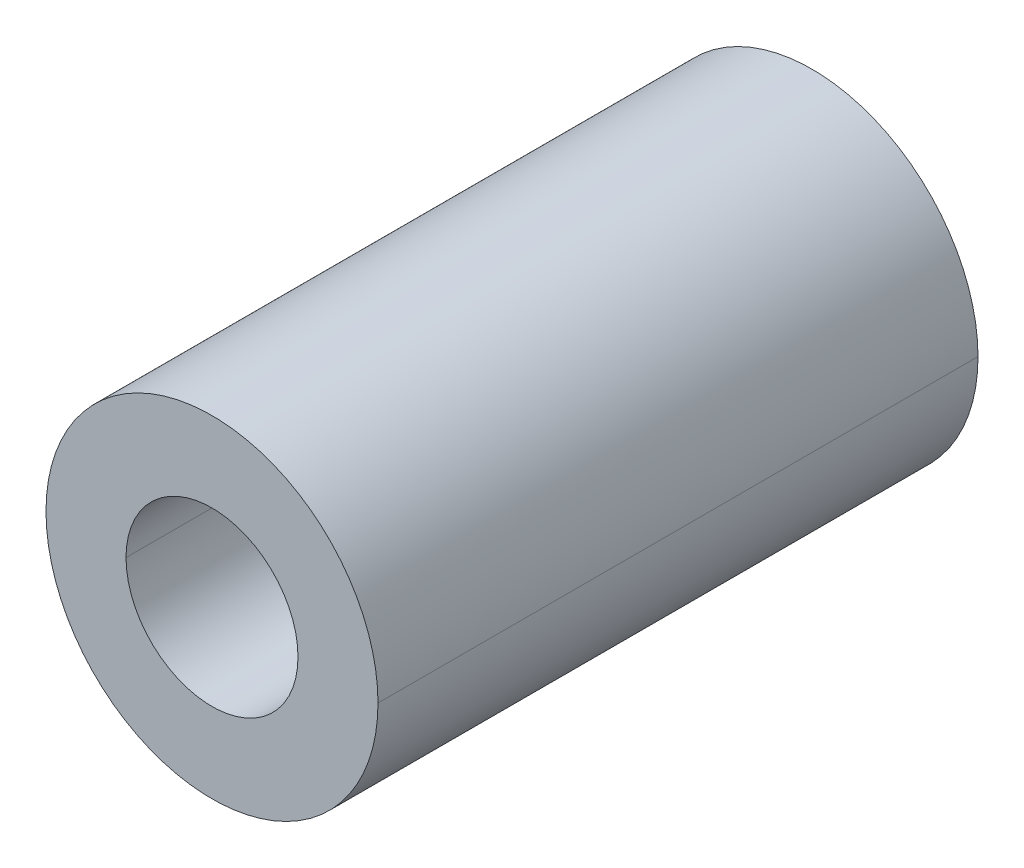
ISO-10303-21;
HEADER;
FILE_DESCRIPTION(('STEP AP214'),'2;1');
FILE_NAME('part.step','',(''),(''),'','','');
FILE_SCHEMA(('AUTOMOTIVE_DESIGN { 1 0 10303 214 1 1 1 1 }'));
ENDSEC;
DATA;
#1=APPLICATION_CONTEXT('core data for automotive mechanical design processes');
#2=APPLICATION_PROTOCOL_DEFINITION('international standard','automotive_design',2000,#1);
#3=PRODUCT_CONTEXT('',#1,'mechanical');
#4=PRODUCT('Part','Part','',(#3));
#5=PRODUCT_RELATED_PRODUCT_CATEGORY('part','',(#4));
#6=PRODUCT_DEFINITION_FORMATION('','',#4);
#7=PRODUCT_DEFINITION_CONTEXT('part definition',#1,'design');
#8=PRODUCT_DEFINITION('design','',#6,#7);
#9=PRODUCT_DEFINITION_SHAPE('','',#8);
#10=(LENGTH_UNIT() NAMED_UNIT(*) SI_UNIT(.MILLI.,.METRE.));
#11=(NAMED_UNIT(*) PLANE_ANGLE_UNIT() SI_UNIT($,.RADIAN.));
#12=(NAMED_UNIT(*) SI_UNIT($,.STERADIAN.) SOLID_ANGLE_UNIT());
#13=UNCERTAINTY_MEASURE_WITH_UNIT(LENGTH_MEASURE(1.E-05),#10,'distance_accuracy_value','');
#14=(GEOMETRIC_REPRESENTATION_CONTEXT(3) GLOBAL_UNCERTAINTY_ASSIGNED_CONTEXT((#13)) GLOBAL_UNIT_ASSIGNED_CONTEXT((#10,
#11,#12)) REPRESENTATION_CONTEXT('',''));
#15=CARTESIAN_POINT('',(0.,0.,0.));
#16=DIRECTION('',(0.,0.,1.));
#17=DIRECTION('',(1.,0.,0.));
#18=AXIS2_PLACEMENT_3D('',#15,#16,#17);
#19=CARTESIAN_POINT('',(0.,0.,228.6));
#20=DIRECTION('',(0.,0.,-1.));
#21=DIRECTION('',(-1.,0.,0.));
#22=AXIS2_PLACEMENT_3D('',#19,#20,#21);
#23=CYLINDRICAL_SURFACE('',#22,3.2766);
#24=CARTESIAN_POINT('',(0.,0.,-205.74));
#25=DIRECTION('',(0.,0.,1.));
#26=DIRECTION('',(1.,0.,0.));
#27=AXIS2_PLACEMENT_3D('',#24,#25,#26);
#28=CIRCLE('',#27,3.2766);
#29=CARTESIAN_POINT('',(3.2766,0.,-205.74));
#30=VERTEX_POINT('',#29);
#31=CARTESIAN_POINT('',(-3.2766,0.,-205.74));
#32=VERTEX_POINT('',#31);
#33=EDGE_CURVE('E72',#30,#32,#28,.F.);
#34=ORIENTED_EDGE('',*,*,#33,.F.);
#35=DIRECTION('',(0.,0.,-1.));
#36=VECTOR('',#35,1.);
#37=CARTESIAN_POINT('',(3.2766,0.,228.6));
#38=LINE('',#37,#36);
#39=CARTESIAN_POINT('',(3.2766,0.,-228.6));
#40=VERTEX_POINT('',#39);
#41=EDGE_CURVE('E60',#30,#40,#38,.T.);
#42=ORIENTED_EDGE('',*,*,#41,.T.);
#43=CARTESIAN_POINT('',(0.,0.,-228.6));
#44=DIRECTION('',(0.,0.,1.));
#45=DIRECTION('',(1.,0.,0.));
#46=AXIS2_PLACEMENT_3D('',#43,#44,#45);
#47=CIRCLE('',#46,3.2766);
#48=CARTESIAN_POINT('',(-3.2766,0.,-228.6));
#49=VERTEX_POINT('',#48);
#50=EDGE_CURVE('E122',#49,#40,#47,.T.);
#51=ORIENTED_EDGE('',*,*,#50,.F.);
#52=DIRECTION('',(0.,0.,-1.));
#53=VECTOR('',#52,1.);
#54=CARTESIAN_POINT('',(-3.2766,0.,228.6));
#55=LINE('',#54,#53);
#56=EDGE_CURVE('E100',#32,#49,#55,.T.);
#57=ORIENTED_EDGE('',*,*,#56,.F.);
#58=EDGE_LOOP('',(#34,#42,#51,#57));
#59=FACE_BOUND('',#58,.T.);
#60=ADVANCED_FACE('F51',(#59),#23,.F.);
#61=CARTESIAN_POINT('',(0.,0.,228.6));
#62=DIRECTION('',(0.,0.,-1.));
#63=DIRECTION('',(-1.,0.,0.));
#64=AXIS2_PLACEMENT_3D('',#61,#62,#63);
#65=CYLINDRICAL_SURFACE('',#64,6.3246);
#66=DIRECTION('',(0.,0.,-1.));
#67=VECTOR('',#66,1.);
#68=CARTESIAN_POINT('',(-6.3246,0.,228.6));
#69=LINE('',#68,#67);
#70=CARTESIAN_POINT('',(-6.3246,0.,-205.74));
#71=VERTEX_POINT('',#70);
#72=CARTESIAN_POINT('',(-6.3246,0.,-228.6));
#73=VERTEX_POINT('',#72);
#74=EDGE_CURVE('E116',#71,#73,#69,.T.);
#75=ORIENTED_EDGE('',*,*,#74,.F.);
#76=CARTESIAN_POINT('',(0.,0.,-205.74));
#77=DIRECTION('',(0.,0.,1.));
#78=DIRECTION('',(1.,0.,0.));
#79=AXIS2_PLACEMENT_3D('',#76,#77,#78);
#80=CIRCLE('',#79,6.3246);
#81=CARTESIAN_POINT('',(6.3246,0.,-205.74));
#82=VERTEX_POINT('',#81);
#83=EDGE_CURVE('E66',#71,#82,#80,.F.);
#84=ORIENTED_EDGE('',*,*,#83,.T.);
#85=DIRECTION('',(0.,0.,-1.));
#86=VECTOR('',#85,1.);
#87=CARTESIAN_POINT('',(6.3246,0.,228.6));
#88=LINE('',#87,#86);
#89=CARTESIAN_POINT('',(6.3246,0.,-228.6));
#90=VERTEX_POINT('',#89);
#91=EDGE_CURVE('E108',#82,#90,#88,.T.);
#92=ORIENTED_EDGE('',*,*,#91,.T.);
#93=CARTESIAN_POINT('',(0.,0.,-228.6));
#94=DIRECTION('',(0.,0.,1.));
#95=DIRECTION('',(1.,0.,0.));
#96=AXIS2_PLACEMENT_3D('',#93,#94,#95);
#97=CIRCLE('',#96,6.3246);
#98=EDGE_CURVE('E112',#90,#73,#97,.T.);
#99=ORIENTED_EDGE('',*,*,#98,.T.);
#100=EDGE_LOOP('',(#75,#84,#92,#99));
#101=FACE_BOUND('',#100,.T.);
#102=ADVANCED_FACE('F139',(#101),#65,.T.);
#103=CARTESIAN_POINT('',(0.,0.,228.6));
#104=DIRECTION('',(0.,0.,-1.));
#105=DIRECTION('',(-1.,0.,0.));
#106=AXIS2_PLACEMENT_3D('',#103,#104,#105);
#107=CYLINDRICAL_SURFACE('',#106,6.3246);
#108=ORIENTED_EDGE('',*,*,#91,.F.);
#109=CARTESIAN_POINT('',(0.,0.,-205.74));
#110=DIRECTION('',(0.,0.,1.));
#111=DIRECTION('',(1.,0.,0.));
#112=AXIS2_PLACEMENT_3D('',#109,#110,#111);
#113=CIRCLE('',#112,6.3246);
#114=EDGE_CURVE('E102',#82,#71,#113,.F.);
#115=ORIENTED_EDGE('',*,*,#114,.T.);
#116=ORIENTED_EDGE('',*,*,#74,.T.);
#117=CARTESIAN_POINT('',(0.,0.,-228.6));
#118=DIRECTION('',(0.,0.,1.));
#119=DIRECTION('',(1.,0.,0.));
#120=AXIS2_PLACEMENT_3D('',#117,#118,#119);
#121=CIRCLE('',#120,6.3246);
#122=EDGE_CURVE('E119',#73,#90,#121,.T.);
#123=ORIENTED_EDGE('',*,*,#122,.T.);
#124=EDGE_LOOP('',(#108,#115,#116,#123));
#125=FACE_BOUND('',#124,.T.);
#126=ADVANCED_FACE('F136',(#125),#107,.T.);
#127=CARTESIAN_POINT('',(0.,0.,228.6));
#128=DIRECTION('',(0.,0.,-1.));
#129=DIRECTION('',(-1.,0.,0.));
#130=AXIS2_PLACEMENT_3D('',#127,#128,#129);
#131=CYLINDRICAL_SURFACE('',#130,3.2766);
#132=CARTESIAN_POINT('',(0.,0.,-205.74));
#133=DIRECTION('',(0.,0.,1.));
#134=DIRECTION('',(1.,0.,0.));
#135=AXIS2_PLACEMENT_3D('',#132,#133,#134);
#136=CIRCLE('',#135,3.2766);
#137=EDGE_CURVE('E11',#32,#30,#136,.F.);
#138=ORIENTED_EDGE('',*,*,#137,.F.);
#139=ORIENTED_EDGE('',*,*,#56,.T.);
#140=CARTESIAN_POINT('',(0.,0.,-228.6));
#141=DIRECTION('',(0.,0.,1.));
#142=DIRECTION('',(1.,0.,0.));
#143=AXIS2_PLACEMENT_3D('',#140,#141,#142);
#144=CIRCLE('',#143,3.2766);
#145=EDGE_CURVE('E106',#40,#49,#144,.T.);
#146=ORIENTED_EDGE('',*,*,#145,.F.);
#147=ORIENTED_EDGE('',*,*,#41,.F.);
#148=EDGE_LOOP('',(#138,#139,#146,#147));
#149=FACE_BOUND('',#148,.T.);
#150=ADVANCED_FACE('F53',(#149),#131,.F.);
#151=CARTESIAN_POINT('',(0.,0.,-228.6));
#152=DIRECTION('',(0.,0.,1.));
#153=DIRECTION('',(1.,0.,0.));
#154=AXIS2_PLACEMENT_3D('',#151,#152,#153);
#155=PLANE('',#154);
#156=ORIENTED_EDGE('',*,*,#122,.F.);
#157=ORIENTED_EDGE('',*,*,#98,.F.);
#158=EDGE_LOOP('',(#156,#157));
#159=FACE_BOUND('',#158,.T.);
#160=ORIENTED_EDGE('',*,*,#50,.T.);
#161=ORIENTED_EDGE('',*,*,#145,.T.);
#162=EDGE_LOOP('',(#160,#161));
#163=FACE_BOUND('',#162,.T.);
#164=ADVANCED_FACE('F141',(#159,#163),#155,.F.);
#165=CARTESIAN_POINT('',(0.,0.,-205.74));
#166=DIRECTION('',(0.,0.,1.));
#167=DIRECTION('',(1.,0.,0.));
#168=AXIS2_PLACEMENT_3D('',#165,#166,#167);
#169=PLANE('',#168);
#170=ORIENTED_EDGE('',*,*,#114,.F.);
#171=ORIENTED_EDGE('',*,*,#83,.F.);
#172=EDGE_LOOP('',(#170,#171));
#173=FACE_BOUND('',#172,.T.);
#174=ORIENTED_EDGE('',*,*,#33,.T.);
#175=ORIENTED_EDGE('',*,*,#137,.T.);
#176=EDGE_LOOP('',(#174,#175));
#177=FACE_BOUND('',#176,.T.);
#178=ADVANCED_FACE('F93',(#173,#177),#169,.T.);
#179=CLOSED_SHELL('',(#60,#102,#126,#150,#164,#178));
#180=MANIFOLD_SOLID_BREP('B2',#179);
#181=ADVANCED_BREP_SHAPE_REPRESENTATION('',(#18,#180),#14);
#182=SHAPE_DEFINITION_REPRESENTATION(#9,#181);
ENDSEC;
END-ISO-10303-21;
